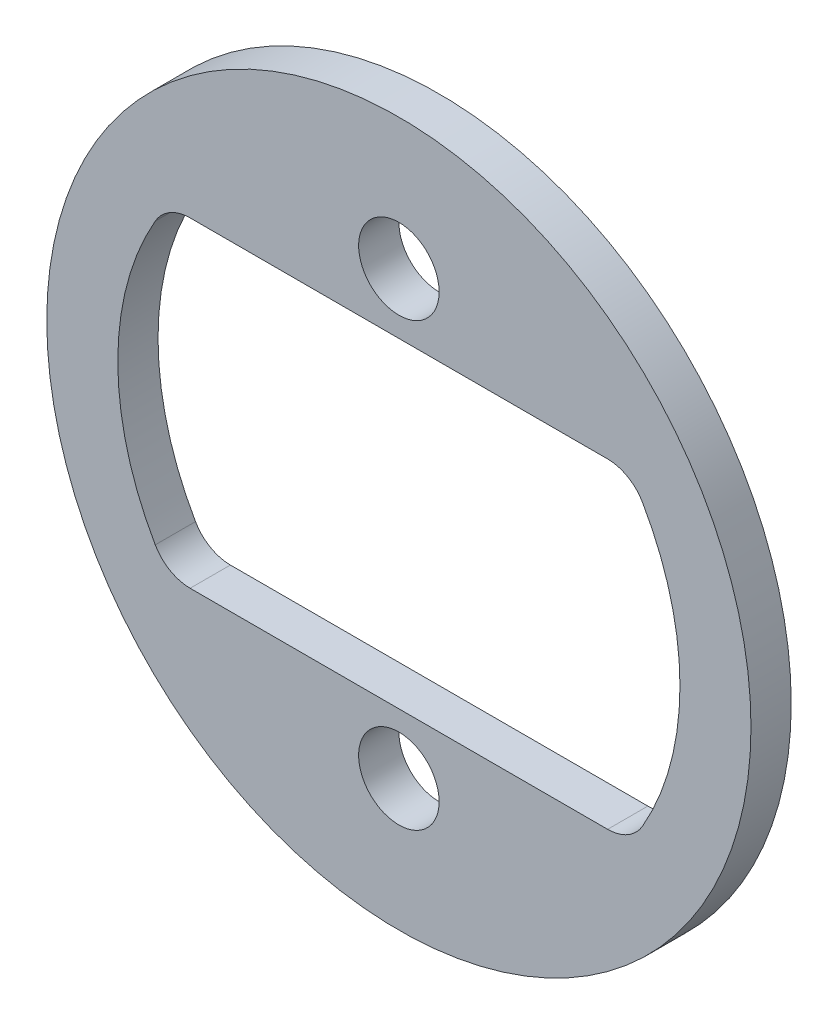
ISO-10303-21;
HEADER;
FILE_DESCRIPTION(('STEP AP214'),'2;1');
FILE_NAME('part.step','',(''),(''),'','','');
FILE_SCHEMA(('AUTOMOTIVE_DESIGN { 1 0 10303 214 1 1 1 1 }'));
ENDSEC;
DATA;
#1=APPLICATION_CONTEXT('core data for automotive mechanical design processes');
#2=APPLICATION_PROTOCOL_DEFINITION('international standard','automotive_design',2000,#1);
#3=PRODUCT_CONTEXT('',#1,'mechanical');
#4=PRODUCT('Part','Part','',(#3));
#5=PRODUCT_RELATED_PRODUCT_CATEGORY('part','',(#4));
#6=PRODUCT_DEFINITION_FORMATION('','',#4);
#7=PRODUCT_DEFINITION_CONTEXT('part definition',#1,'design');
#8=PRODUCT_DEFINITION('design','',#6,#7);
#9=PRODUCT_DEFINITION_SHAPE('','',#8);
#10=(LENGTH_UNIT() NAMED_UNIT(*) SI_UNIT(.MILLI.,.METRE.));
#11=(NAMED_UNIT(*) PLANE_ANGLE_UNIT() SI_UNIT($,.RADIAN.));
#12=(NAMED_UNIT(*) SI_UNIT($,.STERADIAN.) SOLID_ANGLE_UNIT());
#13=UNCERTAINTY_MEASURE_WITH_UNIT(LENGTH_MEASURE(1.E-05),#10,'distance_accuracy_value','');
#14=(GEOMETRIC_REPRESENTATION_CONTEXT(3) GLOBAL_UNCERTAINTY_ASSIGNED_CONTEXT((#13)) GLOBAL_UNIT_ASSIGNED_CONTEXT((#10,
#11,#12)) REPRESENTATION_CONTEXT('',''));
#15=CARTESIAN_POINT('',(0.,0.,0.));
#16=DIRECTION('',(0.,0.,1.));
#17=DIRECTION('',(1.,0.,0.));
#18=AXIS2_PLACEMENT_3D('',#15,#16,#17);
#19=CARTESIAN_POINT('',(0.,-7.97,2.));
#20=DIRECTION('',(0.,-1.,0.));
#21=DIRECTION('',(0.,0.,-1.));
#22=AXIS2_PLACEMENT_3D('',#19,#20,#21);
#23=PLANE('',#22);
#24=DIRECTION('',(-1.,0.,0.));
#25=VECTOR('',#24,1.);
#26=CARTESIAN_POINT('',(0.,-7.97,2.));
#27=LINE('',#26,#25);
#28=CARTESIAN_POINT('',(10.3749698794744,-7.97,2.));
#29=VERTEX_POINT('',#28);
#30=CARTESIAN_POINT('',(-10.3749698794744,-7.97,2.));
#31=VERTEX_POINT('',#30);
#32=EDGE_CURVE('E131',#29,#31,#27,.T.);
#33=ORIENTED_EDGE('',*,*,#32,.F.);
#34=DIRECTION('',(0.,0.,-1.));
#35=VECTOR('',#34,1.);
#36=CARTESIAN_POINT('',(10.3749698794744,-7.97,2.));
#37=LINE('',#36,#35);
#38=CARTESIAN_POINT('',(10.3749698794744,-7.97,0.));
#39=VERTEX_POINT('',#38);
#40=EDGE_CURVE('E116',#29,#39,#37,.T.);
#41=ORIENTED_EDGE('',*,*,#40,.T.);
#42=DIRECTION('',(-1.,0.,0.));
#43=VECTOR('',#42,1.);
#44=CARTESIAN_POINT('',(0.,-7.97,0.));
#45=LINE('',#44,#43);
#46=CARTESIAN_POINT('',(-10.3749698794744,-7.97,0.));
#47=VERTEX_POINT('',#46);
#48=EDGE_CURVE('E129',#39,#47,#45,.T.);
#49=ORIENTED_EDGE('',*,*,#48,.T.);
#50=DIRECTION('',(0.,0.,-1.));
#51=VECTOR('',#50,1.);
#52=CARTESIAN_POINT('',(-10.3749698794744,-7.97,2.));
#53=LINE('',#52,#51);
#54=EDGE_CURVE('E134',#47,#31,#53,.F.);
#55=ORIENTED_EDGE('',*,*,#54,.T.);
#56=EDGE_LOOP('',(#33,#41,#49,#55));
#57=FACE_BOUND('',#56,.T.);
#58=ADVANCED_FACE('F45',(#57),#23,.F.);
#59=CARTESIAN_POINT('',(0.,0.,2.));
#60=DIRECTION('',(0.,0.,-1.));
#61=DIRECTION('',(-1.,0.,0.));
#62=AXIS2_PLACEMENT_3D('',#59,#60,#61);
#63=CYLINDRICAL_SURFACE('',#62,13.97);
#64=CARTESIAN_POINT('',(0.,0.,2.));
#65=DIRECTION('',(0.,0.,1.));
#66=DIRECTION('',(1.,0.,0.));
#67=AXIS2_PLACEMENT_3D('',#64,#65,#66);
#68=CIRCLE('',#67,13.97);
#69=CARTESIAN_POINT('',(-12.108465264516,6.96749373433584,2.));
#70=VERTEX_POINT('',#69);
#71=CARTESIAN_POINT('',(-12.108465264516,-6.96749373433584,2.));
#72=VERTEX_POINT('',#71);
#73=EDGE_CURVE('E210',#70,#72,#68,.T.);
#74=ORIENTED_EDGE('',*,*,#73,.T.);
#75=DIRECTION('',(0.,0.,-1.));
#76=VECTOR('',#75,1.);
#77=CARTESIAN_POINT('',(-12.108465264516,-6.96749373433584,2.));
#78=LINE('',#77,#76);
#79=CARTESIAN_POINT('',(-12.108465264516,-6.96749373433584,0.));
#80=VERTEX_POINT('',#79);
#81=EDGE_CURVE('E124',#72,#80,#78,.T.);
#82=ORIENTED_EDGE('',*,*,#81,.T.);
#83=CARTESIAN_POINT('',(0.,0.,0.));
#84=DIRECTION('',(0.,0.,1.));
#85=DIRECTION('',(1.,0.,0.));
#86=AXIS2_PLACEMENT_3D('',#83,#84,#85);
#87=CIRCLE('',#86,13.97);
#88=CARTESIAN_POINT('',(-12.108465264516,6.96749373433584,0.));
#89=VERTEX_POINT('',#88);
#90=EDGE_CURVE('E141',#89,#80,#87,.T.);
#91=ORIENTED_EDGE('',*,*,#90,.F.);
#92=DIRECTION('',(0.,0.,-1.));
#93=VECTOR('',#92,1.);
#94=CARTESIAN_POINT('',(-12.108465264516,6.96749373433584,2.));
#95=LINE('',#94,#93);
#96=EDGE_CURVE('E68',#89,#70,#95,.F.);
#97=ORIENTED_EDGE('',*,*,#96,.T.);
#98=EDGE_LOOP('',(#74,#82,#91,#97));
#99=FACE_BOUND('',#98,.T.);
#100=ADVANCED_FACE('F200',(#99),#63,.F.);
#101=CARTESIAN_POINT('',(0.,7.97,2.));
#102=DIRECTION('',(0.,-1.,0.));
#103=DIRECTION('',(1.,0.,0.));
#104=AXIS2_PLACEMENT_3D('',#101,#102,#103);
#105=PLANE('',#104);
#106=DIRECTION('',(-1.,0.,0.));
#107=VECTOR('',#106,1.);
#108=CARTESIAN_POINT('',(0.,7.97,0.));
#109=LINE('',#108,#107);
#110=CARTESIAN_POINT('',(10.3749698794743,7.97,0.));
#111=VERTEX_POINT('',#110);
#112=CARTESIAN_POINT('',(-10.3749698794744,7.97,0.));
#113=VERTEX_POINT('',#112);
#114=EDGE_CURVE('E146',#111,#113,#109,.T.);
#115=ORIENTED_EDGE('',*,*,#114,.F.);
#116=DIRECTION('',(0.,0.,1.));
#117=VECTOR('',#116,1.);
#118=CARTESIAN_POINT('',(10.3749698794743,7.97,2.));
#119=LINE('',#118,#117);
#120=CARTESIAN_POINT('',(10.3749698794743,7.97,2.));
#121=VERTEX_POINT('',#120);
#122=EDGE_CURVE('E177',#111,#121,#119,.T.);
#123=ORIENTED_EDGE('',*,*,#122,.T.);
#124=DIRECTION('',(-1.,0.,0.));
#125=VECTOR('',#124,1.);
#126=CARTESIAN_POINT('',(0.,7.97,2.));
#127=LINE('',#126,#125);
#128=CARTESIAN_POINT('',(-10.3749698794744,7.97,2.));
#129=VERTEX_POINT('',#128);
#130=EDGE_CURVE('E208',#121,#129,#127,.T.);
#131=ORIENTED_EDGE('',*,*,#130,.T.);
#132=DIRECTION('',(0.,0.,1.));
#133=VECTOR('',#132,1.);
#134=CARTESIAN_POINT('',(-10.3749698794744,7.97,0.));
#135=LINE('',#134,#133);
#136=EDGE_CURVE('E173',#129,#113,#135,.F.);
#137=ORIENTED_EDGE('',*,*,#136,.T.);
#138=EDGE_LOOP('',(#115,#123,#131,#137));
#139=FACE_BOUND('',#138,.T.);
#140=ADVANCED_FACE('F212',(#139),#105,.T.);
#141=CARTESIAN_POINT('',(0.,0.,2.));
#142=DIRECTION('',(0.,0.,-1.));
#143=DIRECTION('',(-1.,0.,0.));
#144=AXIS2_PLACEMENT_3D('',#141,#142,#143);
#145=CYLINDRICAL_SURFACE('',#144,17.5);
#146=CARTESIAN_POINT('',(0.,0.,2.));
#147=DIRECTION('',(0.,0.,1.));
#148=DIRECTION('',(1.,0.,0.));
#149=AXIS2_PLACEMENT_3D('',#146,#147,#148);
#150=CIRCLE('',#149,17.5);
#151=CARTESIAN_POINT('',(17.5,0.,2.));
#152=VERTEX_POINT('',#151);
#153=EDGE_CURVE('E220',#152,#152,#150,.T.);
#154=ORIENTED_EDGE('',*,*,#153,.F.);
#155=EDGE_LOOP('',(#154));
#156=FACE_BOUND('',#155,.T.);
#157=CARTESIAN_POINT('',(0.,0.,0.));
#158=DIRECTION('',(0.,0.,1.));
#159=DIRECTION('',(1.,0.,0.));
#160=AXIS2_PLACEMENT_3D('',#157,#158,#159);
#161=CIRCLE('',#160,17.5);
#162=CARTESIAN_POINT('',(17.5,0.,0.));
#163=VERTEX_POINT('',#162);
#164=EDGE_CURVE('E156',#163,#163,#161,.T.);
#165=ORIENTED_EDGE('',*,*,#164,.T.);
#166=EDGE_LOOP('',(#165));
#167=FACE_BOUND('',#166,.T.);
#168=ADVANCED_FACE('F278',(#156,#167),#145,.T.);
#169=CARTESIAN_POINT('',(12.108465264516,-6.96749373433584,0.));
#170=VERTEX_POINT('',#169);
#171=CARTESIAN_POINT('',(12.108465264516,6.96749373433584,0.));
#172=VERTEX_POINT('',#171);
#173=EDGE_CURVE('E148',#170,#172,#87,.T.);
#174=ORIENTED_EDGE('',*,*,#173,.F.);
#175=DIRECTION('',(0.,0.,-1.));
#176=VECTOR('',#175,1.);
#177=CARTESIAN_POINT('',(12.108465264516,-6.96749373433584,2.));
#178=LINE('',#177,#176);
#179=CARTESIAN_POINT('',(12.108465264516,-6.96749373433584,2.));
#180=VERTEX_POINT('',#179);
#181=EDGE_CURVE('E117',#170,#180,#178,.F.);
#182=ORIENTED_EDGE('',*,*,#181,.T.);
#183=CARTESIAN_POINT('',(12.108465264516,6.96749373433584,2.));
#184=VERTEX_POINT('',#183);
#185=EDGE_CURVE('E215',#180,#184,#68,.T.);
#186=ORIENTED_EDGE('',*,*,#185,.T.);
#187=DIRECTION('',(0.,0.,-1.));
#188=VECTOR('',#187,1.);
#189=CARTESIAN_POINT('',(12.108465264516,6.96749373433584,2.));
#190=LINE('',#189,#188);
#191=EDGE_CURVE('E133',#184,#172,#190,.T.);
#192=ORIENTED_EDGE('',*,*,#191,.T.);
#193=EDGE_LOOP('',(#174,#182,#186,#192));
#194=FACE_BOUND('',#193,.T.);
#195=ADVANCED_FACE('F251',(#194),#63,.F.);
#196=CARTESIAN_POINT('',(0.,-10.97,2.));
#197=DIRECTION('',(0.,0.,-1.));
#198=DIRECTION('',(-1.,0.,0.));
#199=AXIS2_PLACEMENT_3D('',#196,#197,#198);
#200=CYLINDRICAL_SURFACE('',#199,2.);
#201=CARTESIAN_POINT('',(0.,-10.97,2.));
#202=DIRECTION('',(0.,0.,1.));
#203=DIRECTION('',(1.,0.,0.));
#204=AXIS2_PLACEMENT_3D('',#201,#202,#203);
#205=CIRCLE('',#204,2.);
#206=CARTESIAN_POINT('',(2.,-10.97,2.));
#207=VERTEX_POINT('',#206);
#208=EDGE_CURVE('E164',#207,#207,#205,.T.);
#209=ORIENTED_EDGE('',*,*,#208,.T.);
#210=EDGE_LOOP('',(#209));
#211=FACE_BOUND('',#210,.T.);
#212=CARTESIAN_POINT('',(0.,-10.97,0.));
#213=DIRECTION('',(0.,0.,1.));
#214=DIRECTION('',(1.,0.,0.));
#215=AXIS2_PLACEMENT_3D('',#212,#213,#214);
#216=CIRCLE('',#215,2.);
#217=CARTESIAN_POINT('',(2.,-10.97,0.));
#218=VERTEX_POINT('',#217);
#219=EDGE_CURVE('E142',#218,#218,#216,.T.);
#220=ORIENTED_EDGE('',*,*,#219,.F.);
#221=EDGE_LOOP('',(#220));
#222=FACE_BOUND('',#221,.T.);
#223=ADVANCED_FACE('F242',(#211,#222),#200,.F.);
#224=CARTESIAN_POINT('',(0.,10.97,2.));
#225=DIRECTION('',(0.,0.,-1.));
#226=DIRECTION('',(-1.,0.,0.));
#227=AXIS2_PLACEMENT_3D('',#224,#225,#226);
#228=CYLINDRICAL_SURFACE('',#227,2.);
#229=CARTESIAN_POINT('',(0.,10.97,2.));
#230=DIRECTION('',(0.,0.,1.));
#231=DIRECTION('',(1.,0.,0.));
#232=AXIS2_PLACEMENT_3D('',#229,#230,#231);
#233=CIRCLE('',#232,2.);
#234=CARTESIAN_POINT('',(2.,10.97,2.));
#235=VERTEX_POINT('',#234);
#236=EDGE_CURVE('E166',#235,#235,#233,.T.);
#237=ORIENTED_EDGE('',*,*,#236,.T.);
#238=EDGE_LOOP('',(#237));
#239=FACE_BOUND('',#238,.T.);
#240=CARTESIAN_POINT('',(0.,10.97,0.));
#241=DIRECTION('',(0.,0.,1.));
#242=DIRECTION('',(1.,0.,0.));
#243=AXIS2_PLACEMENT_3D('',#240,#241,#242);
#244=CIRCLE('',#243,2.);
#245=CARTESIAN_POINT('',(2.,10.97,0.));
#246=VERTEX_POINT('',#245);
#247=EDGE_CURVE('E160',#246,#246,#244,.T.);
#248=ORIENTED_EDGE('',*,*,#247,.F.);
#249=EDGE_LOOP('',(#248));
#250=FACE_BOUND('',#249,.T.);
#251=ADVANCED_FACE('F230',(#239,#250),#228,.F.);
#252=CARTESIAN_POINT('',(0.,0.,2.));
#253=DIRECTION('',(0.,0.,1.));
#254=DIRECTION('',(1.,0.,0.));
#255=AXIS2_PLACEMENT_3D('',#252,#253,#254);
#256=PLANE('',#255);
#257=ORIENTED_EDGE('',*,*,#208,.F.);
#258=EDGE_LOOP('',(#257));
#259=FACE_BOUND('',#258,.T.);
#260=ORIENTED_EDGE('',*,*,#185,.F.);
#261=CARTESIAN_POINT('',(10.3749698794744,-5.97,2.));
#262=DIRECTION('',(0.,0.,1.));
#263=DIRECTION('',(1.,0.,0.));
#264=AXIS2_PLACEMENT_3D('',#261,#262,#263);
#265=CIRCLE('',#264,2.);
#266=EDGE_CURVE('E123',#180,#29,#265,.F.);
#267=ORIENTED_EDGE('',*,*,#266,.T.);
#268=ORIENTED_EDGE('',*,*,#32,.T.);
#269=CARTESIAN_POINT('',(-10.3749698794744,-5.97,2.));
#270=DIRECTION('',(0.,0.,1.));
#271=DIRECTION('',(1.,0.,0.));
#272=AXIS2_PLACEMENT_3D('',#269,#270,#271);
#273=CIRCLE('',#272,2.);
#274=EDGE_CURVE('E61',#31,#72,#273,.F.);
#275=ORIENTED_EDGE('',*,*,#274,.T.);
#276=ORIENTED_EDGE('',*,*,#73,.F.);
#277=CARTESIAN_POINT('',(-10.3749698794744,5.97,2.));
#278=DIRECTION('',(0.,0.,1.));
#279=DIRECTION('',(1.,0.,0.));
#280=AXIS2_PLACEMENT_3D('',#277,#278,#279);
#281=CIRCLE('',#280,2.);
#282=EDGE_CURVE('E11',#70,#129,#281,.F.);
#283=ORIENTED_EDGE('',*,*,#282,.T.);
#284=ORIENTED_EDGE('',*,*,#130,.F.);
#285=CARTESIAN_POINT('',(10.3749698794743,5.97,2.));
#286=DIRECTION('',(0.,0.,1.));
#287=DIRECTION('',(1.,0.,0.));
#288=AXIS2_PLACEMENT_3D('',#285,#286,#287);
#289=CIRCLE('',#288,2.);
#290=EDGE_CURVE('E190',#121,#184,#289,.F.);
#291=ORIENTED_EDGE('',*,*,#290,.T.);
#292=EDGE_LOOP('',(#260,#267,#268,#275,#276,#283,#284,#291));
#293=FACE_BOUND('',#292,.T.);
#294=ORIENTED_EDGE('',*,*,#153,.T.);
#295=EDGE_LOOP('',(#294));
#296=FACE_BOUND('',#295,.T.);
#297=ORIENTED_EDGE('',*,*,#236,.F.);
#298=EDGE_LOOP('',(#297));
#299=FACE_BOUND('',#298,.T.);
#300=ADVANCED_FACE('F206',(#259,#293,#296,#299),#256,.T.);
#301=CARTESIAN_POINT('',(0.,0.,0.));
#302=DIRECTION('',(0.,0.,1.));
#303=DIRECTION('',(1.,0.,0.));
#304=AXIS2_PLACEMENT_3D('',#301,#302,#303);
#305=PLANE('',#304);
#306=ORIENTED_EDGE('',*,*,#219,.T.);
#307=EDGE_LOOP('',(#306));
#308=FACE_BOUND('',#307,.T.);
#309=ORIENTED_EDGE('',*,*,#48,.F.);
#310=CARTESIAN_POINT('',(10.3749698794744,-5.97,0.));
#311=DIRECTION('',(0.,0.,1.));
#312=DIRECTION('',(1.,0.,0.));
#313=AXIS2_PLACEMENT_3D('',#310,#311,#312);
#314=CIRCLE('',#313,2.);
#315=EDGE_CURVE('E112',#39,#170,#314,.T.);
#316=ORIENTED_EDGE('',*,*,#315,.T.);
#317=ORIENTED_EDGE('',*,*,#173,.T.);
#318=CARTESIAN_POINT('',(10.3749698794743,5.97,0.));
#319=DIRECTION('',(0.,0.,1.));
#320=DIRECTION('',(1.,0.,0.));
#321=AXIS2_PLACEMENT_3D('',#318,#319,#320);
#322=CIRCLE('',#321,2.);
#323=EDGE_CURVE('E187',#172,#111,#322,.T.);
#324=ORIENTED_EDGE('',*,*,#323,.T.);
#325=ORIENTED_EDGE('',*,*,#114,.T.);
#326=CARTESIAN_POINT('',(-10.3749698794744,5.97,0.));
#327=DIRECTION('',(0.,0.,1.));
#328=DIRECTION('',(1.,0.,0.));
#329=AXIS2_PLACEMENT_3D('',#326,#327,#328);
#330=CIRCLE('',#329,2.);
#331=EDGE_CURVE('E54',#113,#89,#330,.T.);
#332=ORIENTED_EDGE('',*,*,#331,.T.);
#333=ORIENTED_EDGE('',*,*,#90,.T.);
#334=CARTESIAN_POINT('',(-10.3749698794744,-5.97,0.));
#335=DIRECTION('',(0.,0.,1.));
#336=DIRECTION('',(1.,0.,0.));
#337=AXIS2_PLACEMENT_3D('',#334,#335,#336);
#338=CIRCLE('',#337,2.);
#339=EDGE_CURVE('E139',#80,#47,#338,.T.);
#340=ORIENTED_EDGE('',*,*,#339,.T.);
#341=EDGE_LOOP('',(#309,#316,#317,#324,#325,#332,#333,#340));
#342=FACE_BOUND('',#341,.T.);
#343=ORIENTED_EDGE('',*,*,#164,.F.);
#344=EDGE_LOOP('',(#343));
#345=FACE_BOUND('',#344,.T.);
#346=ORIENTED_EDGE('',*,*,#247,.T.);
#347=EDGE_LOOP('',(#346));
#348=FACE_BOUND('',#347,.T.);
#349=ADVANCED_FACE('F136',(#308,#342,#345,#348),#305,.F.);
#350=CARTESIAN_POINT('',(10.3749698794744,-5.97,2.));
#351=DIRECTION('',(0.,0.,-1.));
#352=DIRECTION('',(-1.,0.,0.));
#353=AXIS2_PLACEMENT_3D('',#350,#351,#352);
#354=CYLINDRICAL_SURFACE('',#353,2.);
#355=ORIENTED_EDGE('',*,*,#266,.F.);
#356=ORIENTED_EDGE('',*,*,#181,.F.);
#357=ORIENTED_EDGE('',*,*,#315,.F.);
#358=ORIENTED_EDGE('',*,*,#40,.F.);
#359=EDGE_LOOP('',(#355,#356,#357,#358));
#360=FACE_BOUND('',#359,.T.);
#361=ADVANCED_FACE('F115',(#360),#354,.F.);
#362=CARTESIAN_POINT('',(10.3749698794743,5.97,2.));
#363=DIRECTION('',(0.,0.,-1.));
#364=DIRECTION('',(-1.,0.,0.));
#365=AXIS2_PLACEMENT_3D('',#362,#363,#364);
#366=CYLINDRICAL_SURFACE('',#365,2.);
#367=ORIENTED_EDGE('',*,*,#290,.F.);
#368=ORIENTED_EDGE('',*,*,#122,.F.);
#369=ORIENTED_EDGE('',*,*,#323,.F.);
#370=ORIENTED_EDGE('',*,*,#191,.F.);
#371=EDGE_LOOP('',(#367,#368,#369,#370));
#372=FACE_BOUND('',#371,.T.);
#373=ADVANCED_FACE('F259',(#372),#366,.F.);
#374=CARTESIAN_POINT('',(-10.3749698794744,-5.97,2.));
#375=DIRECTION('',(0.,0.,-1.));
#376=DIRECTION('',(-1.,0.,0.));
#377=AXIS2_PLACEMENT_3D('',#374,#375,#376);
#378=CYLINDRICAL_SURFACE('',#377,2.);
#379=ORIENTED_EDGE('',*,*,#274,.F.);
#380=ORIENTED_EDGE('',*,*,#54,.F.);
#381=ORIENTED_EDGE('',*,*,#339,.F.);
#382=ORIENTED_EDGE('',*,*,#81,.F.);
#383=EDGE_LOOP('',(#379,#380,#381,#382));
#384=FACE_BOUND('',#383,.T.);
#385=ADVANCED_FACE('F261',(#384),#378,.F.);
#386=CARTESIAN_POINT('',(-10.3749698794744,5.97,2.));
#387=DIRECTION('',(0.,0.,-1.));
#388=DIRECTION('',(-1.,0.,0.));
#389=AXIS2_PLACEMENT_3D('',#386,#387,#388);
#390=CYLINDRICAL_SURFACE('',#389,2.);
#391=ORIENTED_EDGE('',*,*,#282,.F.);
#392=ORIENTED_EDGE('',*,*,#96,.F.);
#393=ORIENTED_EDGE('',*,*,#331,.F.);
#394=ORIENTED_EDGE('',*,*,#136,.F.);
#395=EDGE_LOOP('',(#391,#392,#393,#394));
#396=FACE_BOUND('',#395,.T.);
#397=ADVANCED_FACE('F47',(#396),#390,.F.);
#398=CLOSED_SHELL('',(#58,#100,#140,#168,#195,#223,#251,#300,#349,#361,#373,#385,#397));
#399=MANIFOLD_SOLID_BREP('B2',#398);
#400=ADVANCED_BREP_SHAPE_REPRESENTATION('',(#18,#399),#14);
#401=SHAPE_DEFINITION_REPRESENTATION(#9,#400);
ENDSEC;
END-ISO-10303-21;
